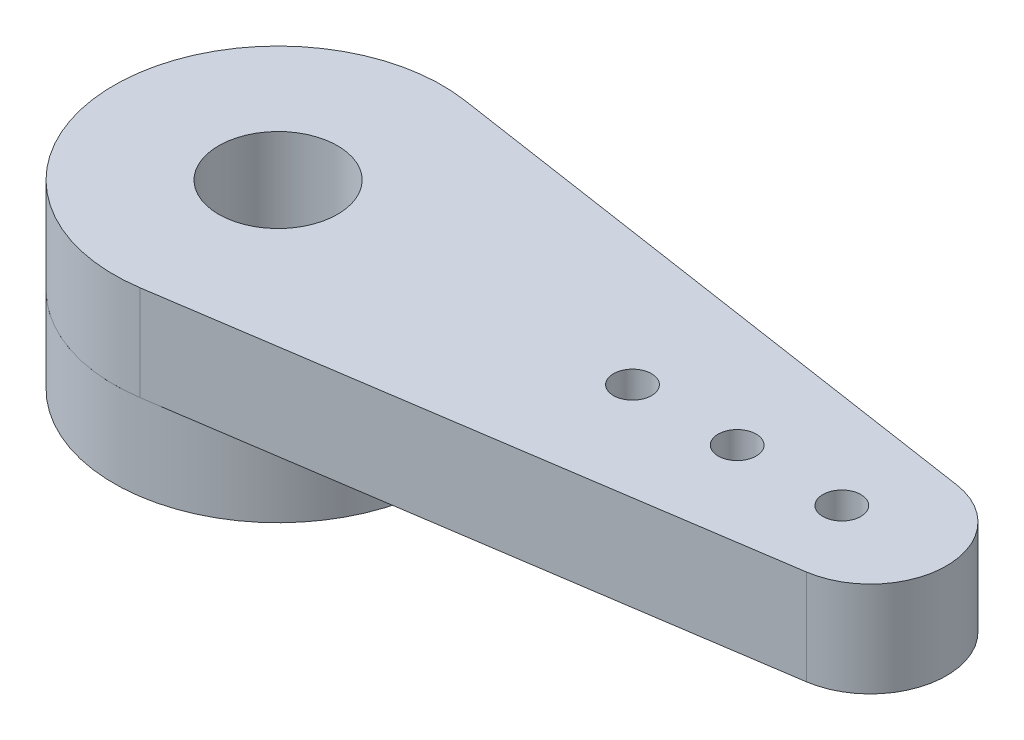
ISO-10303-21;
HEADER;
FILE_DESCRIPTION(('STEP AP214'),'2;1');
FILE_NAME('part.step','',(''),(''),'','','');
FILE_SCHEMA(('AUTOMOTIVE_DESIGN { 1 0 10303 214 1 1 1 1 }'));
ENDSEC;
DATA;
#1=APPLICATION_CONTEXT('core data for automotive mechanical design processes');
#2=APPLICATION_PROTOCOL_DEFINITION('international standard','automotive_design',2000,#1);
#3=PRODUCT_CONTEXT('',#1,'mechanical');
#4=PRODUCT('Part','Part','',(#3));
#5=PRODUCT_RELATED_PRODUCT_CATEGORY('part','',(#4));
#6=PRODUCT_DEFINITION_FORMATION('','',#4);
#7=PRODUCT_DEFINITION_CONTEXT('part definition',#1,'design');
#8=PRODUCT_DEFINITION('design','',#6,#7);
#9=PRODUCT_DEFINITION_SHAPE('','',#8);
#10=(LENGTH_UNIT() NAMED_UNIT(*) SI_UNIT(.MILLI.,.METRE.));
#11=(NAMED_UNIT(*) PLANE_ANGLE_UNIT() SI_UNIT($,.RADIAN.));
#12=(NAMED_UNIT(*) SI_UNIT($,.STERADIAN.) SOLID_ANGLE_UNIT());
#13=UNCERTAINTY_MEASURE_WITH_UNIT(LENGTH_MEASURE(1.E-05),#10,'distance_accuracy_value','');
#14=(GEOMETRIC_REPRESENTATION_CONTEXT(3) GLOBAL_UNCERTAINTY_ASSIGNED_CONTEXT((#13)) GLOBAL_UNIT_ASSIGNED_CONTEXT((#10,
#11,#12)) REPRESENTATION_CONTEXT('',''));
#15=CARTESIAN_POINT('',(0.,0.,0.));
#16=DIRECTION('',(0.,0.,1.));
#17=DIRECTION('',(1.,0.,0.));
#18=AXIS2_PLACEMENT_3D('',#15,#16,#17);
#19=CARTESIAN_POINT('',(0.,-1.8,0.));
#20=DIRECTION('',(0.,-1.,0.));
#21=DIRECTION('',(0.,0.,-1.));
#22=AXIS2_PLACEMENT_3D('',#19,#20,#21);
#23=PLANE('',#22);
#24=CARTESIAN_POINT('',(0.,-1.8,0.));
#25=DIRECTION('',(0.,-1.,0.));
#26=DIRECTION('',(0.,0.,-1.));
#27=AXIS2_PLACEMENT_3D('',#24,#25,#26);
#28=CIRCLE('',#27,3.45);
#29=CARTESIAN_POINT('',(0.,-1.8,-3.45));
#30=VERTEX_POINT('',#29);
#31=EDGE_CURVE('E11',#30,#30,#28,.T.);
#32=ORIENTED_EDGE('',*,*,#31,.T.);
#33=EDGE_LOOP('',(#32));
#34=FACE_BOUND('',#33,.T.);
#35=CARTESIAN_POINT('',(0.,-1.8,0.));
#36=DIRECTION('',(0.,-1.,0.));
#37=DIRECTION('',(0.,0.,-1.));
#38=AXIS2_PLACEMENT_3D('',#35,#36,#37);
#39=CIRCLE('',#38,2.25);
#40=CARTESIAN_POINT('',(0.,-1.8,-2.25));
#41=VERTEX_POINT('',#40);
#42=EDGE_CURVE('E51',#41,#41,#39,.T.);
#43=ORIENTED_EDGE('',*,*,#42,.F.);
#44=EDGE_LOOP('',(#43));
#45=FACE_BOUND('',#44,.T.);
#46=ADVANCED_FACE('F40',(#34,#45),#23,.T.);
#47=CARTESIAN_POINT('',(0.,0.,0.));
#48=DIRECTION('',(0.,-1.,0.));
#49=DIRECTION('',(0.,0.,-1.));
#50=AXIS2_PLACEMENT_3D('',#47,#48,#49);
#51=PLANE('',#50);
#52=CARTESIAN_POINT('',(0.,0.,0.));
#53=DIRECTION('',(0.,-1.,0.));
#54=DIRECTION('',(0.,0.,-1.));
#55=AXIS2_PLACEMENT_3D('',#52,#53,#54);
#56=CIRCLE('',#55,3.45);
#57=CARTESIAN_POINT('',(0.,0.,-3.45));
#58=VERTEX_POINT('',#57);
#59=EDGE_CURVE('E44',#58,#58,#56,.T.);
#60=ORIENTED_EDGE('',*,*,#59,.F.);
#61=EDGE_LOOP('',(#60));
#62=FACE_BOUND('',#61,.T.);
#63=CARTESIAN_POINT('',(0.,0.,0.));
#64=DIRECTION('',(0.,-1.,0.));
#65=DIRECTION('',(0.,0.,-1.));
#66=AXIS2_PLACEMENT_3D('',#63,#64,#65);
#67=CIRCLE('',#66,2.25);
#68=CARTESIAN_POINT('',(0.,0.,-2.25));
#69=VERTEX_POINT('',#68);
#70=EDGE_CURVE('E53',#69,#69,#67,.T.);
#71=ORIENTED_EDGE('',*,*,#70,.T.);
#72=EDGE_LOOP('',(#71));
#73=FACE_BOUND('',#72,.T.);
#74=ADVANCED_FACE('F63',(#62,#73),#51,.F.);
#75=CARTESIAN_POINT('',(0.,-1.8,0.));
#76=DIRECTION('',(0.,1.,0.));
#77=DIRECTION('',(0.,0.,1.));
#78=AXIS2_PLACEMENT_3D('',#75,#76,#77);
#79=CYLINDRICAL_SURFACE('',#78,3.45);
#80=ORIENTED_EDGE('',*,*,#31,.F.);
#81=EDGE_LOOP('',(#80));
#82=FACE_BOUND('',#81,.T.);
#83=ORIENTED_EDGE('',*,*,#59,.T.);
#84=EDGE_LOOP('',(#83));
#85=FACE_BOUND('',#84,.T.);
#86=ADVANCED_FACE('F42',(#82,#85),#79,.T.);
#87=CARTESIAN_POINT('',(0.,-1.8,0.));
#88=DIRECTION('',(0.,1.,0.));
#89=DIRECTION('',(0.,0.,1.));
#90=AXIS2_PLACEMENT_3D('',#87,#88,#89);
#91=CYLINDRICAL_SURFACE('',#90,2.25);
#92=ORIENTED_EDGE('',*,*,#42,.T.);
#93=EDGE_LOOP('',(#92));
#94=FACE_BOUND('',#93,.T.);
#95=ORIENTED_EDGE('',*,*,#70,.F.);
#96=EDGE_LOOP('',(#95));
#97=FACE_BOUND('',#96,.T.);
#98=ADVANCED_FACE('F59',(#94,#97),#91,.F.);
#99=CLOSED_SHELL('',(#46,#74,#86,#98));
#100=MANIFOLD_SOLID_BREP('B2',#99);
#101=CARTESIAN_POINT('',(0.,2.,0.));
#102=DIRECTION('',(0.,-1.,0.));
#103=DIRECTION('',(0.,0.,-1.));
#104=AXIS2_PLACEMENT_3D('',#101,#102,#103);
#105=PLANE('',#104);
#106=CARTESIAN_POINT('',(11.85,2.,0.));
#107=DIRECTION('',(0.,1.,0.));
#108=DIRECTION('',(0.,0.,1.));
#109=AXIS2_PLACEMENT_3D('',#106,#107,#108);
#110=CIRCLE('',#109,0.4);
#111=CARTESIAN_POINT('',(11.85,2.,0.4));
#112=VERTEX_POINT('',#111);
#113=EDGE_CURVE('E189',#112,#112,#110,.T.);
#114=ORIENTED_EDGE('',*,*,#113,.F.);
#115=EDGE_LOOP('',(#114));
#116=FACE_BOUND('',#115,.T.);
#117=CARTESIAN_POINT('',(7.45,2.,0.));
#118=DIRECTION('',(0.,1.,0.));
#119=DIRECTION('',(0.,0.,1.));
#120=AXIS2_PLACEMENT_3D('',#117,#118,#119);
#121=CIRCLE('',#120,0.400000000000001);
#122=CARTESIAN_POINT('',(7.45,2.,0.400000000000001));
#123=VERTEX_POINT('',#122);
#124=EDGE_CURVE('E168',#123,#123,#121,.T.);
#125=ORIENTED_EDGE('',*,*,#124,.F.);
#126=EDGE_LOOP('',(#125));
#127=FACE_BOUND('',#126,.T.);
#128=CARTESIAN_POINT('',(0.,2.,0.));
#129=DIRECTION('',(0.,1.,0.));
#130=DIRECTION('',(0.,0.,-1.));
#131=AXIS2_PLACEMENT_3D('',#128,#129,#130);
#132=CIRCLE('',#131,3.45);
#133=CARTESIAN_POINT('',(0.512650602409639,2.,-3.41169889642229));
#134=VERTEX_POINT('',#133);
#135=CARTESIAN_POINT('',(0.512650602409638,2.,3.41169889642229));
#136=VERTEX_POINT('',#135);
#137=EDGE_CURVE('E153',#134,#136,#132,.T.);
#138=ORIENTED_EDGE('',*,*,#137,.T.);
#139=DIRECTION('',(0.988898230847039,0.,-0.14859437751004));
#140=VECTOR('',#139,1.);
#141=CARTESIAN_POINT('',(0.512650602409638,2.,3.41169889642229));
#142=LINE('',#141,#140);
#143=CARTESIAN_POINT('',(12.6877510040161,2.,1.58223716935526));
#144=VERTEX_POINT('',#143);
#145=EDGE_CURVE('E148',#136,#144,#142,.T.);
#146=ORIENTED_EDGE('',*,*,#145,.T.);
#147=CARTESIAN_POINT('',(12.45,2.,0.));
#148=DIRECTION('',(0.,1.,0.));
#149=DIRECTION('',(0.,0.,-1.));
#150=AXIS2_PLACEMENT_3D('',#147,#148,#149);
#151=CIRCLE('',#150,1.6);
#152=CARTESIAN_POINT('',(12.6877510040161,2.,-1.58223716935526));
#153=VERTEX_POINT('',#152);
#154=EDGE_CURVE('E151',#144,#153,#151,.T.);
#155=ORIENTED_EDGE('',*,*,#154,.T.);
#156=DIRECTION('',(-0.988898230847039,0.,-0.14859437751004));
#157=VECTOR('',#156,1.);
#158=CARTESIAN_POINT('',(0.512650602409639,2.,-3.41169889642229));
#159=LINE('',#158,#157);
#160=EDGE_CURVE('E118',#153,#134,#159,.T.);
#161=ORIENTED_EDGE('',*,*,#160,.T.);
#162=EDGE_LOOP('',(#138,#146,#155,#161));
#163=FACE_BOUND('',#162,.T.);
#164=CARTESIAN_POINT('',(9.65,2.,0.));
#165=DIRECTION('',(0.,1.,0.));
#166=DIRECTION('',(0.,0.,1.));
#167=AXIS2_PLACEMENT_3D('',#164,#165,#166);
#168=CIRCLE('',#167,0.400000000000001);
#169=CARTESIAN_POINT('',(9.65,2.,0.400000000000001));
#170=VERTEX_POINT('',#169);
#171=EDGE_CURVE('E183',#170,#170,#168,.T.);
#172=ORIENTED_EDGE('',*,*,#171,.F.);
#173=EDGE_LOOP('',(#172));
#174=FACE_BOUND('',#173,.T.);
#175=CARTESIAN_POINT('',(0.,2.,0.));
#176=DIRECTION('',(0.,1.,0.));
#177=DIRECTION('',(0.,0.,1.));
#178=AXIS2_PLACEMENT_3D('',#175,#176,#177);
#179=CIRCLE('',#178,1.25);
#180=CARTESIAN_POINT('',(0.,2.,1.25));
#181=VERTEX_POINT('',#180);
#182=EDGE_CURVE('E195',#181,#181,#179,.T.);
#183=ORIENTED_EDGE('',*,*,#182,.F.);
#184=EDGE_LOOP('',(#183));
#185=FACE_BOUND('',#184,.T.);
#186=ADVANCED_FACE('F101',(#116,#127,#163,#174,#185),#105,.F.);
#187=CARTESIAN_POINT('',(0.,0.,0.));
#188=DIRECTION('',(0.,-1.,0.));
#189=DIRECTION('',(0.,0.,-1.));
#190=AXIS2_PLACEMENT_3D('',#187,#188,#189);
#191=PLANE('',#190);
#192=CARTESIAN_POINT('',(11.85,0.,0.));
#193=DIRECTION('',(0.,1.,0.));
#194=DIRECTION('',(0.,0.,1.));
#195=AXIS2_PLACEMENT_3D('',#192,#193,#194);
#196=CIRCLE('',#195,0.4);
#197=CARTESIAN_POINT('',(11.85,0.,0.4));
#198=VERTEX_POINT('',#197);
#199=EDGE_CURVE('E192',#198,#198,#196,.T.);
#200=ORIENTED_EDGE('',*,*,#199,.T.);
#201=EDGE_LOOP('',(#200));
#202=FACE_BOUND('',#201,.T.);
#203=CARTESIAN_POINT('',(7.45,0.,0.));
#204=DIRECTION('',(0.,1.,0.));
#205=DIRECTION('',(0.,0.,1.));
#206=AXIS2_PLACEMENT_3D('',#203,#204,#205);
#207=CIRCLE('',#206,0.400000000000001);
#208=CARTESIAN_POINT('',(7.45,0.,0.400000000000001));
#209=VERTEX_POINT('',#208);
#210=EDGE_CURVE('E180',#209,#209,#207,.T.);
#211=ORIENTED_EDGE('',*,*,#210,.T.);
#212=EDGE_LOOP('',(#211));
#213=FACE_BOUND('',#212,.T.);
#214=CARTESIAN_POINT('',(0.,0.,0.));
#215=DIRECTION('',(0.,1.,0.));
#216=DIRECTION('',(0.,0.,-1.));
#217=AXIS2_PLACEMENT_3D('',#214,#215,#216);
#218=CIRCLE('',#217,3.45);
#219=CARTESIAN_POINT('',(0.512650602409639,0.,-3.41169889642229));
#220=VERTEX_POINT('',#219);
#221=CARTESIAN_POINT('',(0.512650602409638,0.,3.41169889642229));
#222=VERTEX_POINT('',#221);
#223=EDGE_CURVE('E165',#220,#222,#218,.T.);
#224=ORIENTED_EDGE('',*,*,#223,.F.);
#225=DIRECTION('',(-0.988898230847039,0.,-0.14859437751004));
#226=VECTOR('',#225,1.);
#227=CARTESIAN_POINT('',(0.512650602409639,0.,-3.41169889642229));
#228=LINE('',#227,#226);
#229=CARTESIAN_POINT('',(12.6877510040161,0.,-1.58223716935526));
#230=VERTEX_POINT('',#229);
#231=EDGE_CURVE('E141',#230,#220,#228,.T.);
#232=ORIENTED_EDGE('',*,*,#231,.F.);
#233=CARTESIAN_POINT('',(12.45,0.,0.));
#234=DIRECTION('',(0.,1.,0.));
#235=DIRECTION('',(0.,0.,-1.));
#236=AXIS2_PLACEMENT_3D('',#233,#234,#235);
#237=CIRCLE('',#236,1.6);
#238=CARTESIAN_POINT('',(12.6877510040161,0.,1.58223716935526));
#239=VERTEX_POINT('',#238);
#240=EDGE_CURVE('E135',#239,#230,#237,.T.);
#241=ORIENTED_EDGE('',*,*,#240,.F.);
#242=DIRECTION('',(0.988898230847039,0.,-0.14859437751004));
#243=VECTOR('',#242,1.);
#244=CARTESIAN_POINT('',(0.512650602409638,0.,3.41169889642229));
#245=LINE('',#244,#243);
#246=EDGE_CURVE('E157',#222,#239,#245,.T.);
#247=ORIENTED_EDGE('',*,*,#246,.F.);
#248=EDGE_LOOP('',(#224,#232,#241,#247));
#249=FACE_BOUND('',#248,.T.);
#250=CARTESIAN_POINT('',(9.65,0.,0.));
#251=DIRECTION('',(0.,1.,0.));
#252=DIRECTION('',(0.,0.,1.));
#253=AXIS2_PLACEMENT_3D('',#250,#251,#252);
#254=CIRCLE('',#253,0.400000000000001);
#255=CARTESIAN_POINT('',(9.65,0.,0.400000000000001));
#256=VERTEX_POINT('',#255);
#257=EDGE_CURVE('E186',#256,#256,#254,.T.);
#258=ORIENTED_EDGE('',*,*,#257,.T.);
#259=EDGE_LOOP('',(#258));
#260=FACE_BOUND('',#259,.T.);
#261=CARTESIAN_POINT('',(0.,0.,0.));
#262=DIRECTION('',(0.,1.,0.));
#263=DIRECTION('',(0.,0.,1.));
#264=AXIS2_PLACEMENT_3D('',#261,#262,#263);
#265=CIRCLE('',#264,1.25);
#266=CARTESIAN_POINT('',(0.,0.,1.25));
#267=VERTEX_POINT('',#266);
#268=EDGE_CURVE('E198',#267,#267,#265,.T.);
#269=ORIENTED_EDGE('',*,*,#268,.T.);
#270=EDGE_LOOP('',(#269));
#271=FACE_BOUND('',#270,.T.);
#272=ADVANCED_FACE('F176',(#202,#213,#249,#260,#271),#191,.T.);
#273=CARTESIAN_POINT('',(0.,2.,0.));
#274=DIRECTION('',(0.,-1.,0.));
#275=DIRECTION('',(0.,0.,-1.));
#276=AXIS2_PLACEMENT_3D('',#273,#274,#275);
#277=CYLINDRICAL_SURFACE('',#276,3.45);
#278=ORIENTED_EDGE('',*,*,#223,.T.);
#279=DIRECTION('',(0.,-1.,0.));
#280=VECTOR('',#279,1.);
#281=CARTESIAN_POINT('',(0.512650602409638,2.,3.41169889642229));
#282=LINE('',#281,#280);
#283=EDGE_CURVE('E38',#136,#222,#282,.T.);
#284=ORIENTED_EDGE('',*,*,#283,.F.);
#285=ORIENTED_EDGE('',*,*,#137,.F.);
#286=DIRECTION('',(0.,-1.,0.));
#287=VECTOR('',#286,1.);
#288=CARTESIAN_POINT('',(0.512650602409639,2.,-3.41169889642229));
#289=LINE('',#288,#287);
#290=EDGE_CURVE('E161',#134,#220,#289,.T.);
#291=ORIENTED_EDGE('',*,*,#290,.T.);
#292=EDGE_LOOP('',(#278,#284,#285,#291));
#293=FACE_BOUND('',#292,.T.);
#294=ADVANCED_FACE('F103',(#293),#277,.T.);
#295=CARTESIAN_POINT('',(0.512650602409638,2.,3.41169889642229));
#296=DIRECTION('',(-0.14859437751004,0.,-0.988898230847039));
#297=DIRECTION('',(-0.988898230847039,0.,0.14859437751004));
#298=AXIS2_PLACEMENT_3D('',#295,#296,#297);
#299=PLANE('',#298);
#300=ORIENTED_EDGE('',*,*,#246,.T.);
#301=DIRECTION('',(0.,-1.,0.));
#302=VECTOR('',#301,1.);
#303=CARTESIAN_POINT('',(12.6877510040161,2.,1.58223716935526));
#304=LINE('',#303,#302);
#305=EDGE_CURVE('E110',#144,#239,#304,.T.);
#306=ORIENTED_EDGE('',*,*,#305,.F.);
#307=ORIENTED_EDGE('',*,*,#145,.F.);
#308=ORIENTED_EDGE('',*,*,#283,.T.);
#309=EDGE_LOOP('',(#300,#306,#307,#308));
#310=FACE_BOUND('',#309,.T.);
#311=ADVANCED_FACE('F156',(#310),#299,.F.);
#312=CARTESIAN_POINT('',(12.45,2.,0.));
#313=DIRECTION('',(0.,-1.,0.));
#314=DIRECTION('',(0.,0.,-1.));
#315=AXIS2_PLACEMENT_3D('',#312,#313,#314);
#316=CYLINDRICAL_SURFACE('',#315,1.6);
#317=ORIENTED_EDGE('',*,*,#240,.T.);
#318=DIRECTION('',(0.,-1.,0.));
#319=VECTOR('',#318,1.);
#320=CARTESIAN_POINT('',(12.6877510040161,2.,-1.58223716935526));
#321=LINE('',#320,#319);
#322=EDGE_CURVE('E158',#153,#230,#321,.T.);
#323=ORIENTED_EDGE('',*,*,#322,.F.);
#324=ORIENTED_EDGE('',*,*,#154,.F.);
#325=ORIENTED_EDGE('',*,*,#305,.T.);
#326=EDGE_LOOP('',(#317,#323,#324,#325));
#327=FACE_BOUND('',#326,.T.);
#328=ADVANCED_FACE('F159',(#327),#316,.T.);
#329=CARTESIAN_POINT('',(0.512650602409639,2.,-3.41169889642229));
#330=DIRECTION('',(-0.14859437751004,0.,0.988898230847039));
#331=DIRECTION('',(0.988898230847039,0.,0.14859437751004));
#332=AXIS2_PLACEMENT_3D('',#329,#330,#331);
#333=PLANE('',#332);
#334=ORIENTED_EDGE('',*,*,#231,.T.);
#335=ORIENTED_EDGE('',*,*,#290,.F.);
#336=ORIENTED_EDGE('',*,*,#160,.F.);
#337=ORIENTED_EDGE('',*,*,#322,.T.);
#338=EDGE_LOOP('',(#334,#335,#336,#337));
#339=FACE_BOUND('',#338,.T.);
#340=ADVANCED_FACE('F173',(#339),#333,.F.);
#341=CARTESIAN_POINT('',(7.45,2.,0.));
#342=DIRECTION('',(0.,-1.,0.));
#343=DIRECTION('',(0.,0.,-1.));
#344=AXIS2_PLACEMENT_3D('',#341,#342,#343);
#345=CYLINDRICAL_SURFACE('',#344,0.400000000000001);
#346=ORIENTED_EDGE('',*,*,#124,.T.);
#347=EDGE_LOOP('',(#346));
#348=FACE_BOUND('',#347,.T.);
#349=ORIENTED_EDGE('',*,*,#210,.F.);
#350=EDGE_LOOP('',(#349));
#351=FACE_BOUND('',#350,.T.);
#352=ADVANCED_FACE('F218',(#348,#351),#345,.F.);
#353=CARTESIAN_POINT('',(9.65,2.,0.));
#354=DIRECTION('',(0.,-1.,0.));
#355=DIRECTION('',(0.,0.,-1.));
#356=AXIS2_PLACEMENT_3D('',#353,#354,#355);
#357=CYLINDRICAL_SURFACE('',#356,0.400000000000001);
#358=ORIENTED_EDGE('',*,*,#171,.T.);
#359=EDGE_LOOP('',(#358));
#360=FACE_BOUND('',#359,.T.);
#361=ORIENTED_EDGE('',*,*,#257,.F.);
#362=EDGE_LOOP('',(#361));
#363=FACE_BOUND('',#362,.T.);
#364=ADVANCED_FACE('F264',(#360,#363),#357,.F.);
#365=CARTESIAN_POINT('',(11.85,2.,0.));
#366=DIRECTION('',(0.,-1.,0.));
#367=DIRECTION('',(0.,0.,-1.));
#368=AXIS2_PLACEMENT_3D('',#365,#366,#367);
#369=CYLINDRICAL_SURFACE('',#368,0.4);
#370=ORIENTED_EDGE('',*,*,#113,.T.);
#371=EDGE_LOOP('',(#370));
#372=FACE_BOUND('',#371,.T.);
#373=ORIENTED_EDGE('',*,*,#199,.F.);
#374=EDGE_LOOP('',(#373));
#375=FACE_BOUND('',#374,.T.);
#376=ADVANCED_FACE('F272',(#372,#375),#369,.F.);
#377=CARTESIAN_POINT('',(0.,2.,0.));
#378=DIRECTION('',(0.,-1.,0.));
#379=DIRECTION('',(0.,0.,-1.));
#380=AXIS2_PLACEMENT_3D('',#377,#378,#379);
#381=CYLINDRICAL_SURFACE('',#380,1.25);
#382=ORIENTED_EDGE('',*,*,#182,.T.);
#383=EDGE_LOOP('',(#382));
#384=FACE_BOUND('',#383,.T.);
#385=ORIENTED_EDGE('',*,*,#268,.F.);
#386=EDGE_LOOP('',(#385));
#387=FACE_BOUND('',#386,.T.);
#388=ADVANCED_FACE('F204',(#384,#387),#381,.F.);
#389=CLOSED_SHELL('',(#186,#272,#294,#311,#328,#340,#352,#364,#376,#388));
#390=MANIFOLD_SOLID_BREP('B6',#389);
#391=ADVANCED_BREP_SHAPE_REPRESENTATION('',(#18,#100,#390),#14);
#392=SHAPE_DEFINITION_REPRESENTATION(#9,#391);
ENDSEC;
END-ISO-10303-21;
